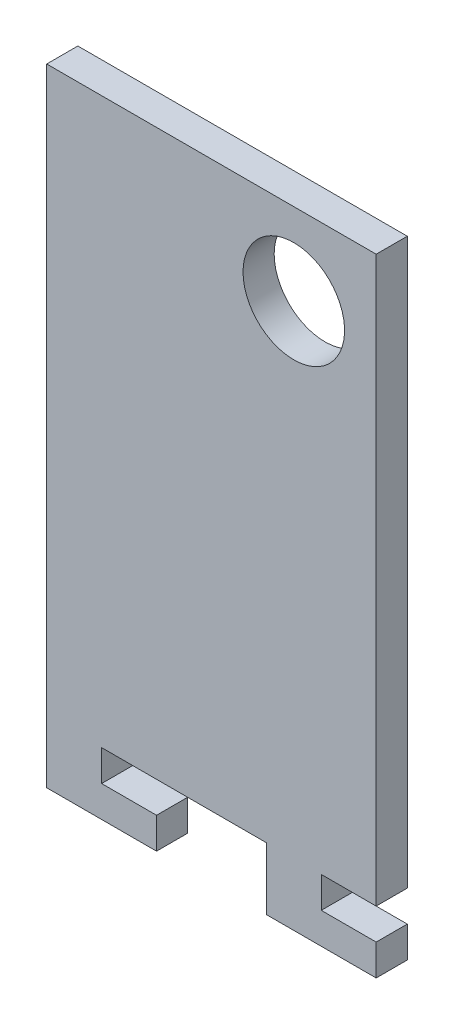
ISO-10303-21;
HEADER;
FILE_DESCRIPTION(('STEP AP214'),'2;1');
FILE_NAME('part.step','',(''),(''),'','','');
FILE_SCHEMA(('AUTOMOTIVE_DESIGN { 1 0 10303 214 1 1 1 1 }'));
ENDSEC;
DATA;
#1=APPLICATION_CONTEXT('core data for automotive mechanical design processes');
#2=APPLICATION_PROTOCOL_DEFINITION('international standard','automotive_design',2000,#1);
#3=PRODUCT_CONTEXT('',#1,'mechanical');
#4=PRODUCT('Part','Part','',(#3));
#5=PRODUCT_RELATED_PRODUCT_CATEGORY('part','',(#4));
#6=PRODUCT_DEFINITION_FORMATION('','',#4);
#7=PRODUCT_DEFINITION_CONTEXT('part definition',#1,'design');
#8=PRODUCT_DEFINITION('design','',#6,#7);
#9=PRODUCT_DEFINITION_SHAPE('','',#8);
#10=(LENGTH_UNIT() NAMED_UNIT(*) SI_UNIT(.MILLI.,.METRE.));
#11=(NAMED_UNIT(*) PLANE_ANGLE_UNIT() SI_UNIT($,.RADIAN.));
#12=(NAMED_UNIT(*) SI_UNIT($,.STERADIAN.) SOLID_ANGLE_UNIT());
#13=UNCERTAINTY_MEASURE_WITH_UNIT(LENGTH_MEASURE(1.E-05),#10,'distance_accuracy_value','');
#14=(GEOMETRIC_REPRESENTATION_CONTEXT(3) GLOBAL_UNCERTAINTY_ASSIGNED_CONTEXT((#13)) GLOBAL_UNIT_ASSIGNED_CONTEXT((#10,
#11,#12)) REPRESENTATION_CONTEXT('',''));
#15=CARTESIAN_POINT('',(0.,0.,0.));
#16=DIRECTION('',(0.,0.,1.));
#17=DIRECTION('',(1.,0.,0.));
#18=AXIS2_PLACEMENT_3D('',#15,#16,#17);
#19=CARTESIAN_POINT('',(0.,0.,4.800000052));
#20=DIRECTION('',(0.,1.,0.));
#21=DIRECTION('',(0.,0.,1.));
#22=AXIS2_PLACEMENT_3D('',#19,#20,#21);
#23=PLANE('',#22);
#24=DIRECTION('',(1.,0.,0.));
#25=VECTOR('',#24,1.);
#26=CARTESIAN_POINT('',(0.,0.,0.));
#27=LINE('',#26,#25);
#28=CARTESIAN_POINT('',(0.,0.,0.));
#29=VERTEX_POINT('',#28);
#30=CARTESIAN_POINT('',(16.9333333333333,0.,0.));
#31=VERTEX_POINT('',#30);
#32=EDGE_CURVE('E252',#29,#31,#27,.T.);
#33=ORIENTED_EDGE('',*,*,#32,.T.);
#34=DIRECTION('',(0.,0.,-1.));
#35=VECTOR('',#34,1.);
#36=CARTESIAN_POINT('',(16.9333333333333,0.,4.800000052));
#37=LINE('',#36,#35);
#38=CARTESIAN_POINT('',(16.9333333333333,0.,4.800000052));
#39=VERTEX_POINT('',#38);
#40=EDGE_CURVE('E189',#39,#31,#37,.T.);
#41=ORIENTED_EDGE('',*,*,#40,.F.);
#42=DIRECTION('',(1.,0.,0.));
#43=VECTOR('',#42,1.);
#44=CARTESIAN_POINT('',(0.,0.,4.800000052));
#45=LINE('',#44,#43);
#46=CARTESIAN_POINT('',(0.,0.,4.800000052));
#47=VERTEX_POINT('',#46);
#48=EDGE_CURVE('E98',#47,#39,#45,.T.);
#49=ORIENTED_EDGE('',*,*,#48,.F.);
#50=DIRECTION('',(0.,0.,-1.));
#51=VECTOR('',#50,1.);
#52=CARTESIAN_POINT('',(0.,0.,4.800000052));
#53=LINE('',#52,#51);
#54=EDGE_CURVE('E13',#47,#29,#53,.T.);
#55=ORIENTED_EDGE('',*,*,#54,.T.);
#56=EDGE_LOOP('',(#33,#41,#49,#55));
#57=FACE_BOUND('',#56,.T.);
#58=ADVANCED_FACE('F46',(#57),#23,.F.);
#59=CARTESIAN_POINT('',(50.8,0.,4.800000052));
#60=DIRECTION('',(-1.,0.,0.));
#61=DIRECTION('',(0.,0.,1.));
#62=AXIS2_PLACEMENT_3D('',#59,#60,#61);
#63=PLANE('',#62);
#64=DIRECTION('',(0.,0.,-1.));
#65=VECTOR('',#64,1.);
#66=CARTESIAN_POINT('',(50.8,9.600000104,4.800000052));
#67=LINE('',#66,#65);
#68=CARTESIAN_POINT('',(50.8,9.600000104,4.800000052));
#69=VERTEX_POINT('',#68);
#70=CARTESIAN_POINT('',(50.8,9.600000104,0.));
#71=VERTEX_POINT('',#70);
#72=EDGE_CURVE('E212',#69,#71,#67,.T.);
#73=ORIENTED_EDGE('',*,*,#72,.T.);
#74=DIRECTION('',(0.,1.,0.));
#75=VECTOR('',#74,1.);
#76=CARTESIAN_POINT('',(50.8,0.,0.));
#77=LINE('',#76,#75);
#78=CARTESIAN_POINT('',(50.8,96.655493252,0.));
#79=VERTEX_POINT('',#78);
#80=EDGE_CURVE('E255',#71,#79,#77,.T.);
#81=ORIENTED_EDGE('',*,*,#80,.T.);
#82=DIRECTION('',(0.,0.,-1.));
#83=VECTOR('',#82,1.);
#84=CARTESIAN_POINT('',(50.8,96.655493252,4.800000052));
#85=LINE('',#84,#83);
#86=CARTESIAN_POINT('',(50.8,96.655493252,4.800000052));
#87=VERTEX_POINT('',#86);
#88=EDGE_CURVE('E261',#87,#79,#85,.T.);
#89=ORIENTED_EDGE('',*,*,#88,.F.);
#90=DIRECTION('',(0.,1.,0.));
#91=VECTOR('',#90,1.);
#92=CARTESIAN_POINT('',(50.8,0.,4.800000052));
#93=LINE('',#92,#91);
#94=EDGE_CURVE('E243',#69,#87,#93,.T.);
#95=ORIENTED_EDGE('',*,*,#94,.F.);
#96=EDGE_LOOP('',(#73,#81,#89,#95));
#97=FACE_BOUND('',#96,.T.);
#98=ADVANCED_FACE('F290',(#97),#63,.F.);
#99=CARTESIAN_POINT('',(0.,0.,4.800000052));
#100=DIRECTION('',(0.,0.,-1.));
#101=DIRECTION('',(-1.,0.,0.));
#102=AXIS2_PLACEMENT_3D('',#99,#100,#101);
#103=PLANE('',#102);
#104=CARTESIAN_POINT('',(38.1,84.0277466,4.800000052));
#105=DIRECTION('',(0.,0.,-1.));
#106=DIRECTION('',(-1.,0.,0.));
#107=AXIS2_PLACEMENT_3D('',#104,#105,#106);
#108=CIRCLE('',#107,7.8277466);
#109=CARTESIAN_POINT('',(30.2722534,84.0277466,4.800000052));
#110=VERTEX_POINT('',#109);
#111=EDGE_CURVE('E233',#110,#110,#108,.T.);
#112=ORIENTED_EDGE('',*,*,#111,.T.);
#113=EDGE_LOOP('',(#112));
#114=FACE_BOUND('',#113,.T.);
#115=ORIENTED_EDGE('',*,*,#48,.T.);
#116=DIRECTION('',(0.,1.,0.));
#117=VECTOR('',#116,1.);
#118=CARTESIAN_POINT('',(16.9333333333333,0.,4.800000052));
#119=LINE('',#118,#117);
#120=CARTESIAN_POINT('',(16.9333333333333,4.800000052,4.800000052));
#121=VERTEX_POINT('',#120);
#122=EDGE_CURVE('E180',#39,#121,#119,.T.);
#123=ORIENTED_EDGE('',*,*,#122,.T.);
#124=DIRECTION('',(-1.,0.,0.));
#125=VECTOR('',#124,1.);
#126=CARTESIAN_POINT('',(16.9333333333333,4.800000052,4.800000052));
#127=LINE('',#126,#125);
#128=CARTESIAN_POINT('',(8.46666666666667,4.800000052,4.800000052));
#129=VERTEX_POINT('',#128);
#130=EDGE_CURVE('E224',#121,#129,#127,.T.);
#131=ORIENTED_EDGE('',*,*,#130,.T.);
#132=DIRECTION('',(0.,1.,0.));
#133=VECTOR('',#132,1.);
#134=CARTESIAN_POINT('',(8.46666666666667,4.800000052,4.800000052));
#135=LINE('',#134,#133);
#136=CARTESIAN_POINT('',(8.46666666666666,9.600000104,4.800000052));
#137=VERTEX_POINT('',#136);
#138=EDGE_CURVE('E164',#129,#137,#135,.T.);
#139=ORIENTED_EDGE('',*,*,#138,.T.);
#140=DIRECTION('',(-1.,0.,0.));
#141=VECTOR('',#140,1.);
#142=CARTESIAN_POINT('',(16.9333333333333,9.600000104,4.800000052));
#143=LINE('',#142,#141);
#144=CARTESIAN_POINT('',(33.8666666666667,9.600000104,4.800000052));
#145=VERTEX_POINT('',#144);
#146=EDGE_CURVE('E156',#145,#137,#143,.T.);
#147=ORIENTED_EDGE('',*,*,#146,.F.);
#148=DIRECTION('',(0.,-1.,0.));
#149=VECTOR('',#148,1.);
#150=CARTESIAN_POINT('',(33.8666666666667,0.,4.800000052));
#151=LINE('',#150,#149);
#152=CARTESIAN_POINT('',(33.8666666666667,0.,4.800000052));
#153=VERTEX_POINT('',#152);
#154=EDGE_CURVE('E160',#145,#153,#151,.T.);
#155=ORIENTED_EDGE('',*,*,#154,.T.);
#156=CARTESIAN_POINT('',(50.8,0.,4.800000052));
#157=VERTEX_POINT('',#156);
#158=EDGE_CURVE('E241',#153,#157,#45,.T.);
#159=ORIENTED_EDGE('',*,*,#158,.T.);
#160=CARTESIAN_POINT('',(50.8,4.800000052,4.800000052));
#161=VERTEX_POINT('',#160);
#162=EDGE_CURVE('E244',#157,#161,#93,.T.);
#163=ORIENTED_EDGE('',*,*,#162,.T.);
#164=DIRECTION('',(-1.,0.,0.));
#165=VECTOR('',#164,1.);
#166=CARTESIAN_POINT('',(0.,4.800000052,4.800000052));
#167=LINE('',#166,#165);
#168=CARTESIAN_POINT('',(42.3333333333333,4.800000052,4.800000052));
#169=VERTEX_POINT('',#168);
#170=EDGE_CURVE('E193',#161,#169,#167,.T.);
#171=ORIENTED_EDGE('',*,*,#170,.T.);
#172=DIRECTION('',(0.,1.,0.));
#173=VECTOR('',#172,1.);
#174=CARTESIAN_POINT('',(42.3333333333333,0.,4.800000052));
#175=LINE('',#174,#173);
#176=CARTESIAN_POINT('',(42.3333333333333,9.600000104,4.800000052));
#177=VERTEX_POINT('',#176);
#178=EDGE_CURVE('E196',#169,#177,#175,.T.);
#179=ORIENTED_EDGE('',*,*,#178,.T.);
#180=DIRECTION('',(-1.,0.,0.));
#181=VECTOR('',#180,1.);
#182=CARTESIAN_POINT('',(0.,9.600000104,4.800000052));
#183=LINE('',#182,#181);
#184=EDGE_CURVE('E200',#69,#177,#183,.T.);
#185=ORIENTED_EDGE('',*,*,#184,.F.);
#186=ORIENTED_EDGE('',*,*,#94,.T.);
#187=DIRECTION('',(-1.,0.,0.));
#188=VECTOR('',#187,1.);
#189=CARTESIAN_POINT('',(0.,96.655493252,4.800000052));
#190=LINE('',#189,#188);
#191=CARTESIAN_POINT('',(0.,96.655493252,4.800000052));
#192=VERTEX_POINT('',#191);
#193=EDGE_CURVE('E70',#87,#192,#190,.T.);
#194=ORIENTED_EDGE('',*,*,#193,.T.);
#195=DIRECTION('',(0.,-1.,0.));
#196=VECTOR('',#195,1.);
#197=CARTESIAN_POINT('',(0.,0.,4.800000052));
#198=LINE('',#197,#196);
#199=EDGE_CURVE('E239',#192,#47,#198,.T.);
#200=ORIENTED_EDGE('',*,*,#199,.T.);
#201=EDGE_LOOP('',(#115,#123,#131,#139,#147,#155,#159,#163,#171,#179,#185,#186,#194,#200));
#202=FACE_BOUND('',#201,.T.);
#203=ADVANCED_FACE('F158',(#114,#202),#103,.F.);
#204=CARTESIAN_POINT('',(0.,0.,0.));
#205=DIRECTION('',(0.,0.,-1.));
#206=DIRECTION('',(-1.,0.,0.));
#207=AXIS2_PLACEMENT_3D('',#204,#205,#206);
#208=PLANE('',#207);
#209=DIRECTION('',(0.,1.,0.));
#210=VECTOR('',#209,1.);
#211=CARTESIAN_POINT('',(16.9333333333333,0.,0.));
#212=LINE('',#211,#210);
#213=CARTESIAN_POINT('',(16.9333333333333,4.800000052,0.));
#214=VERTEX_POINT('',#213);
#215=EDGE_CURVE('E186',#31,#214,#212,.T.);
#216=ORIENTED_EDGE('',*,*,#215,.F.);
#217=ORIENTED_EDGE('',*,*,#32,.F.);
#218=DIRECTION('',(0.,-1.,0.));
#219=VECTOR('',#218,1.);
#220=CARTESIAN_POINT('',(0.,0.,0.));
#221=LINE('',#220,#219);
#222=CARTESIAN_POINT('',(0.,96.655493252,0.));
#223=VERTEX_POINT('',#222);
#224=EDGE_CURVE('E236',#223,#29,#221,.T.);
#225=ORIENTED_EDGE('',*,*,#224,.F.);
#226=DIRECTION('',(-1.,0.,0.));
#227=VECTOR('',#226,1.);
#228=CARTESIAN_POINT('',(0.,96.655493252,0.));
#229=LINE('',#228,#227);
#230=EDGE_CURVE('E91',#79,#223,#229,.T.);
#231=ORIENTED_EDGE('',*,*,#230,.F.);
#232=ORIENTED_EDGE('',*,*,#80,.F.);
#233=DIRECTION('',(-1.,0.,0.));
#234=VECTOR('',#233,1.);
#235=CARTESIAN_POINT('',(0.,9.600000104,0.));
#236=LINE('',#235,#234);
#237=CARTESIAN_POINT('',(42.3333333333333,9.600000104,0.));
#238=VERTEX_POINT('',#237);
#239=EDGE_CURVE('E197',#71,#238,#236,.T.);
#240=ORIENTED_EDGE('',*,*,#239,.T.);
#241=DIRECTION('',(0.,1.,0.));
#242=VECTOR('',#241,1.);
#243=CARTESIAN_POINT('',(42.3333333333333,0.,0.));
#244=LINE('',#243,#242);
#245=CARTESIAN_POINT('',(42.3333333333333,4.800000052,0.));
#246=VERTEX_POINT('',#245);
#247=EDGE_CURVE('E204',#246,#238,#244,.T.);
#248=ORIENTED_EDGE('',*,*,#247,.F.);
#249=DIRECTION('',(-1.,0.,0.));
#250=VECTOR('',#249,1.);
#251=CARTESIAN_POINT('',(0.,4.800000052,0.));
#252=LINE('',#251,#250);
#253=CARTESIAN_POINT('',(50.8,4.800000052,0.));
#254=VERTEX_POINT('',#253);
#255=EDGE_CURVE('E61',#254,#246,#252,.T.);
#256=ORIENTED_EDGE('',*,*,#255,.F.);
#257=CARTESIAN_POINT('',(50.8,0.,0.));
#258=VERTEX_POINT('',#257);
#259=EDGE_CURVE('E256',#258,#254,#77,.T.);
#260=ORIENTED_EDGE('',*,*,#259,.F.);
#261=CARTESIAN_POINT('',(33.8666666666667,0.,0.));
#262=VERTEX_POINT('',#261);
#263=EDGE_CURVE('E251',#262,#258,#27,.T.);
#264=ORIENTED_EDGE('',*,*,#263,.F.);
#265=DIRECTION('',(0.,-1.,0.));
#266=VECTOR('',#265,1.);
#267=CARTESIAN_POINT('',(33.8666666666667,0.,0.));
#268=LINE('',#267,#266);
#269=CARTESIAN_POINT('',(33.8666666666667,9.600000104,0.));
#270=VERTEX_POINT('',#269);
#271=EDGE_CURVE('E183',#270,#262,#268,.T.);
#272=ORIENTED_EDGE('',*,*,#271,.F.);
#273=DIRECTION('',(-1.,0.,0.));
#274=VECTOR('',#273,1.);
#275=CARTESIAN_POINT('',(16.9333333333333,9.600000104,0.));
#276=LINE('',#275,#274);
#277=CARTESIAN_POINT('',(8.46666666666666,9.600000104,0.));
#278=VERTEX_POINT('',#277);
#279=EDGE_CURVE('E173',#270,#278,#276,.T.);
#280=ORIENTED_EDGE('',*,*,#279,.T.);
#281=DIRECTION('',(0.,1.,0.));
#282=VECTOR('',#281,1.);
#283=CARTESIAN_POINT('',(8.46666666666667,4.800000052,0.));
#284=LINE('',#283,#282);
#285=CARTESIAN_POINT('',(8.46666666666667,4.800000052,0.));
#286=VERTEX_POINT('',#285);
#287=EDGE_CURVE('E227',#286,#278,#284,.T.);
#288=ORIENTED_EDGE('',*,*,#287,.F.);
#289=DIRECTION('',(-1.,0.,0.));
#290=VECTOR('',#289,1.);
#291=CARTESIAN_POINT('',(16.9333333333333,4.800000052,0.));
#292=LINE('',#291,#290);
#293=EDGE_CURVE('E167',#214,#286,#292,.T.);
#294=ORIENTED_EDGE('',*,*,#293,.F.);
#295=EDGE_LOOP('',(#216,#217,#225,#231,#232,#240,#248,#256,#260,#264,#272,#280,#288,#294));
#296=FACE_BOUND('',#295,.T.);
#297=CARTESIAN_POINT('',(38.1,84.0277466,0.));
#298=DIRECTION('',(0.,0.,-1.));
#299=DIRECTION('',(-1.,0.,0.));
#300=AXIS2_PLACEMENT_3D('',#297,#298,#299);
#301=CIRCLE('',#300,7.8277466);
#302=CARTESIAN_POINT('',(30.2722534,84.0277466,0.));
#303=VERTEX_POINT('',#302);
#304=EDGE_CURVE('E211',#303,#303,#301,.T.);
#305=ORIENTED_EDGE('',*,*,#304,.F.);
#306=EDGE_LOOP('',(#305));
#307=FACE_BOUND('',#306,.T.);
#308=ADVANCED_FACE('F273',(#296,#307),#208,.T.);
#309=CARTESIAN_POINT('',(0.,0.,4.800000052));
#310=DIRECTION('',(1.,0.,0.));
#311=DIRECTION('',(0.,0.,-1.));
#312=AXIS2_PLACEMENT_3D('',#309,#310,#311);
#313=PLANE('',#312);
#314=ORIENTED_EDGE('',*,*,#224,.T.);
#315=ORIENTED_EDGE('',*,*,#54,.F.);
#316=ORIENTED_EDGE('',*,*,#199,.F.);
#317=DIRECTION('',(0.,0.,-1.));
#318=VECTOR('',#317,1.);
#319=CARTESIAN_POINT('',(0.,96.655493252,4.800000052));
#320=LINE('',#319,#318);
#321=EDGE_CURVE('E248',#192,#223,#320,.T.);
#322=ORIENTED_EDGE('',*,*,#321,.T.);
#323=EDGE_LOOP('',(#314,#315,#316,#322));
#324=FACE_BOUND('',#323,.T.);
#325=ADVANCED_FACE('F48',(#324),#313,.F.);
#326=ORIENTED_EDGE('',*,*,#158,.F.);
#327=DIRECTION('',(0.,0.,-1.));
#328=VECTOR('',#327,1.);
#329=CARTESIAN_POINT('',(33.8666666666667,0.,4.800000052));
#330=LINE('',#329,#328);
#331=EDGE_CURVE('E176',#153,#262,#330,.T.);
#332=ORIENTED_EDGE('',*,*,#331,.T.);
#333=ORIENTED_EDGE('',*,*,#263,.T.);
#334=DIRECTION('',(0.,0.,-1.));
#335=VECTOR('',#334,1.);
#336=CARTESIAN_POINT('',(50.8,0.,4.800000052));
#337=LINE('',#336,#335);
#338=EDGE_CURVE('E54',#157,#258,#337,.T.);
#339=ORIENTED_EDGE('',*,*,#338,.F.);
#340=EDGE_LOOP('',(#326,#332,#333,#339));
#341=FACE_BOUND('',#340,.T.);
#342=ADVANCED_FACE('F282',(#341),#23,.F.);
#343=ORIENTED_EDGE('',*,*,#259,.T.);
#344=DIRECTION('',(0.,0.,-1.));
#345=VECTOR('',#344,1.);
#346=CARTESIAN_POINT('',(50.8,4.800000052,4.800000052));
#347=LINE('',#346,#345);
#348=EDGE_CURVE('E209',#161,#254,#347,.T.);
#349=ORIENTED_EDGE('',*,*,#348,.F.);
#350=ORIENTED_EDGE('',*,*,#162,.F.);
#351=ORIENTED_EDGE('',*,*,#338,.T.);
#352=EDGE_LOOP('',(#343,#349,#350,#351));
#353=FACE_BOUND('',#352,.T.);
#354=ADVANCED_FACE('F267',(#353),#63,.F.);
#355=CARTESIAN_POINT('',(0.,96.655493252,4.800000052));
#356=DIRECTION('',(0.,-1.,0.));
#357=DIRECTION('',(0.,0.,-1.));
#358=AXIS2_PLACEMENT_3D('',#355,#356,#357);
#359=PLANE('',#358);
#360=ORIENTED_EDGE('',*,*,#230,.T.);
#361=ORIENTED_EDGE('',*,*,#321,.F.);
#362=ORIENTED_EDGE('',*,*,#193,.F.);
#363=ORIENTED_EDGE('',*,*,#88,.T.);
#364=EDGE_LOOP('',(#360,#361,#362,#363));
#365=FACE_BOUND('',#364,.T.);
#366=ADVANCED_FACE('F288',(#365),#359,.F.);
#367=CARTESIAN_POINT('',(38.1,84.0277466,4.800000052));
#368=DIRECTION('',(0.,0.,-1.));
#369=DIRECTION('',(-1.,0.,0.));
#370=AXIS2_PLACEMENT_3D('',#367,#368,#369);
#371=CYLINDRICAL_SURFACE('',#370,7.8277466);
#372=ORIENTED_EDGE('',*,*,#111,.F.);
#373=EDGE_LOOP('',(#372));
#374=FACE_BOUND('',#373,.T.);
#375=ORIENTED_EDGE('',*,*,#304,.T.);
#376=EDGE_LOOP('',(#375));
#377=FACE_BOUND('',#376,.T.);
#378=ADVANCED_FACE('F326',(#374,#377),#371,.F.);
#379=CARTESIAN_POINT('',(16.9333333333333,9.600000104,4.800000052));
#380=DIRECTION('',(0.,-1.,0.));
#381=DIRECTION('',(0.,0.,-1.));
#382=AXIS2_PLACEMENT_3D('',#379,#380,#381);
#383=PLANE('',#382);
#384=ORIENTED_EDGE('',*,*,#279,.F.);
#385=DIRECTION('',(0.,0.,-1.));
#386=VECTOR('',#385,1.);
#387=CARTESIAN_POINT('',(33.8666666666667,9.600000104,4.800000052));
#388=LINE('',#387,#386);
#389=EDGE_CURVE('E170',#145,#270,#388,.T.);
#390=ORIENTED_EDGE('',*,*,#389,.F.);
#391=ORIENTED_EDGE('',*,*,#146,.T.);
#392=DIRECTION('',(0.,0.,-1.));
#393=VECTOR('',#392,1.);
#394=CARTESIAN_POINT('',(8.46666666666666,9.600000104,4.800000052));
#395=LINE('',#394,#393);
#396=EDGE_CURVE('E191',#137,#278,#395,.T.);
#397=ORIENTED_EDGE('',*,*,#396,.T.);
#398=EDGE_LOOP('',(#384,#390,#391,#397));
#399=FACE_BOUND('',#398,.T.);
#400=ADVANCED_FACE('F171',(#399),#383,.T.);
#401=CARTESIAN_POINT('',(8.46666666666667,4.800000052,4.800000052));
#402=DIRECTION('',(-1.,0.,0.));
#403=DIRECTION('',(0.,-1.,0.));
#404=AXIS2_PLACEMENT_3D('',#401,#402,#403);
#405=PLANE('',#404);
#406=ORIENTED_EDGE('',*,*,#287,.T.);
#407=ORIENTED_EDGE('',*,*,#396,.F.);
#408=ORIENTED_EDGE('',*,*,#138,.F.);
#409=DIRECTION('',(0.,0.,-1.));
#410=VECTOR('',#409,1.);
#411=CARTESIAN_POINT('',(8.46666666666667,4.800000052,4.800000052));
#412=LINE('',#411,#410);
#413=EDGE_CURVE('E219',#129,#286,#412,.T.);
#414=ORIENTED_EDGE('',*,*,#413,.T.);
#415=EDGE_LOOP('',(#406,#407,#408,#414));
#416=FACE_BOUND('',#415,.T.);
#417=ADVANCED_FACE('F325',(#416),#405,.F.);
#418=CARTESIAN_POINT('',(16.9333333333333,4.800000052,4.800000052));
#419=DIRECTION('',(0.,-1.,0.));
#420=DIRECTION('',(0.,0.,-1.));
#421=AXIS2_PLACEMENT_3D('',#418,#419,#420);
#422=PLANE('',#421);
#423=ORIENTED_EDGE('',*,*,#293,.T.);
#424=ORIENTED_EDGE('',*,*,#413,.F.);
#425=ORIENTED_EDGE('',*,*,#130,.F.);
#426=DIRECTION('',(0.,0.,-1.));
#427=VECTOR('',#426,1.);
#428=CARTESIAN_POINT('',(16.9333333333333,4.800000052,4.800000052));
#429=LINE('',#428,#427);
#430=EDGE_CURVE('E221',#121,#214,#429,.T.);
#431=ORIENTED_EDGE('',*,*,#430,.T.);
#432=EDGE_LOOP('',(#423,#424,#425,#431));
#433=FACE_BOUND('',#432,.T.);
#434=ADVANCED_FACE('F305',(#433),#422,.F.);
#435=CARTESIAN_POINT('',(0.,4.800000052,4.800000052));
#436=DIRECTION('',(0.,-1.,0.));
#437=DIRECTION('',(1.,0.,0.));
#438=AXIS2_PLACEMENT_3D('',#435,#436,#437);
#439=PLANE('',#438);
#440=ORIENTED_EDGE('',*,*,#255,.T.);
#441=DIRECTION('',(0.,0.,-1.));
#442=VECTOR('',#441,1.);
#443=CARTESIAN_POINT('',(42.3333333333333,4.800000052,4.800000052));
#444=LINE('',#443,#442);
#445=EDGE_CURVE('E202',#169,#246,#444,.T.);
#446=ORIENTED_EDGE('',*,*,#445,.F.);
#447=ORIENTED_EDGE('',*,*,#170,.F.);
#448=ORIENTED_EDGE('',*,*,#348,.T.);
#449=EDGE_LOOP('',(#440,#446,#447,#448));
#450=FACE_BOUND('',#449,.T.);
#451=ADVANCED_FACE('F281',(#450),#439,.F.);
#452=CARTESIAN_POINT('',(0.,9.600000104,4.800000052));
#453=DIRECTION('',(0.,-1.,0.));
#454=DIRECTION('',(0.,0.,-1.));
#455=AXIS2_PLACEMENT_3D('',#452,#453,#454);
#456=PLANE('',#455);
#457=ORIENTED_EDGE('',*,*,#239,.F.);
#458=ORIENTED_EDGE('',*,*,#72,.F.);
#459=ORIENTED_EDGE('',*,*,#184,.T.);
#460=DIRECTION('',(0.,0.,-1.));
#461=VECTOR('',#460,1.);
#462=CARTESIAN_POINT('',(42.3333333333333,9.600000104,4.800000052));
#463=LINE('',#462,#461);
#464=EDGE_CURVE('E215',#177,#238,#463,.T.);
#465=ORIENTED_EDGE('',*,*,#464,.T.);
#466=EDGE_LOOP('',(#457,#458,#459,#465));
#467=FACE_BOUND('',#466,.T.);
#468=ADVANCED_FACE('F311',(#467),#456,.T.);
#469=CARTESIAN_POINT('',(42.3333333333333,0.,4.800000052));
#470=DIRECTION('',(-1.,0.,0.));
#471=DIRECTION('',(0.,0.,1.));
#472=AXIS2_PLACEMENT_3D('',#469,#470,#471);
#473=PLANE('',#472);
#474=ORIENTED_EDGE('',*,*,#247,.T.);
#475=ORIENTED_EDGE('',*,*,#464,.F.);
#476=ORIENTED_EDGE('',*,*,#178,.F.);
#477=ORIENTED_EDGE('',*,*,#445,.T.);
#478=EDGE_LOOP('',(#474,#475,#476,#477));
#479=FACE_BOUND('',#478,.T.);
#480=ADVANCED_FACE('F279',(#479),#473,.F.);
#481=CARTESIAN_POINT('',(33.8666666666667,0.,4.800000052));
#482=DIRECTION('',(1.,0.,0.));
#483=DIRECTION('',(0.,0.,-1.));
#484=AXIS2_PLACEMENT_3D('',#481,#482,#483);
#485=PLANE('',#484);
#486=ORIENTED_EDGE('',*,*,#271,.T.);
#487=ORIENTED_EDGE('',*,*,#331,.F.);
#488=ORIENTED_EDGE('',*,*,#154,.F.);
#489=ORIENTED_EDGE('',*,*,#389,.T.);
#490=EDGE_LOOP('',(#486,#487,#488,#489));
#491=FACE_BOUND('',#490,.T.);
#492=ADVANCED_FACE('F178',(#491),#485,.F.);
#493=CARTESIAN_POINT('',(16.9333333333333,0.,4.800000052));
#494=DIRECTION('',(-1.,0.,0.));
#495=DIRECTION('',(0.,0.,1.));
#496=AXIS2_PLACEMENT_3D('',#493,#494,#495);
#497=PLANE('',#496);
#498=ORIENTED_EDGE('',*,*,#122,.F.);
#499=ORIENTED_EDGE('',*,*,#40,.T.);
#500=ORIENTED_EDGE('',*,*,#215,.T.);
#501=ORIENTED_EDGE('',*,*,#430,.F.);
#502=EDGE_LOOP('',(#498,#499,#500,#501));
#503=FACE_BOUND('',#502,.T.);
#504=ADVANCED_FACE('F302',(#503),#497,.F.);
#505=CLOSED_SHELL('',(#58,#98,#203,#308,#325,#342,#354,#366,#378,#400,#417,#434,#451,#468,#480,
#492,#504));
#506=MANIFOLD_SOLID_BREP('B2',#505);
#507=ADVANCED_BREP_SHAPE_REPRESENTATION('',(#18,#506),#14);
#508=SHAPE_DEFINITION_REPRESENTATION(#9,#507);
ENDSEC;
END-ISO-10303-21;
